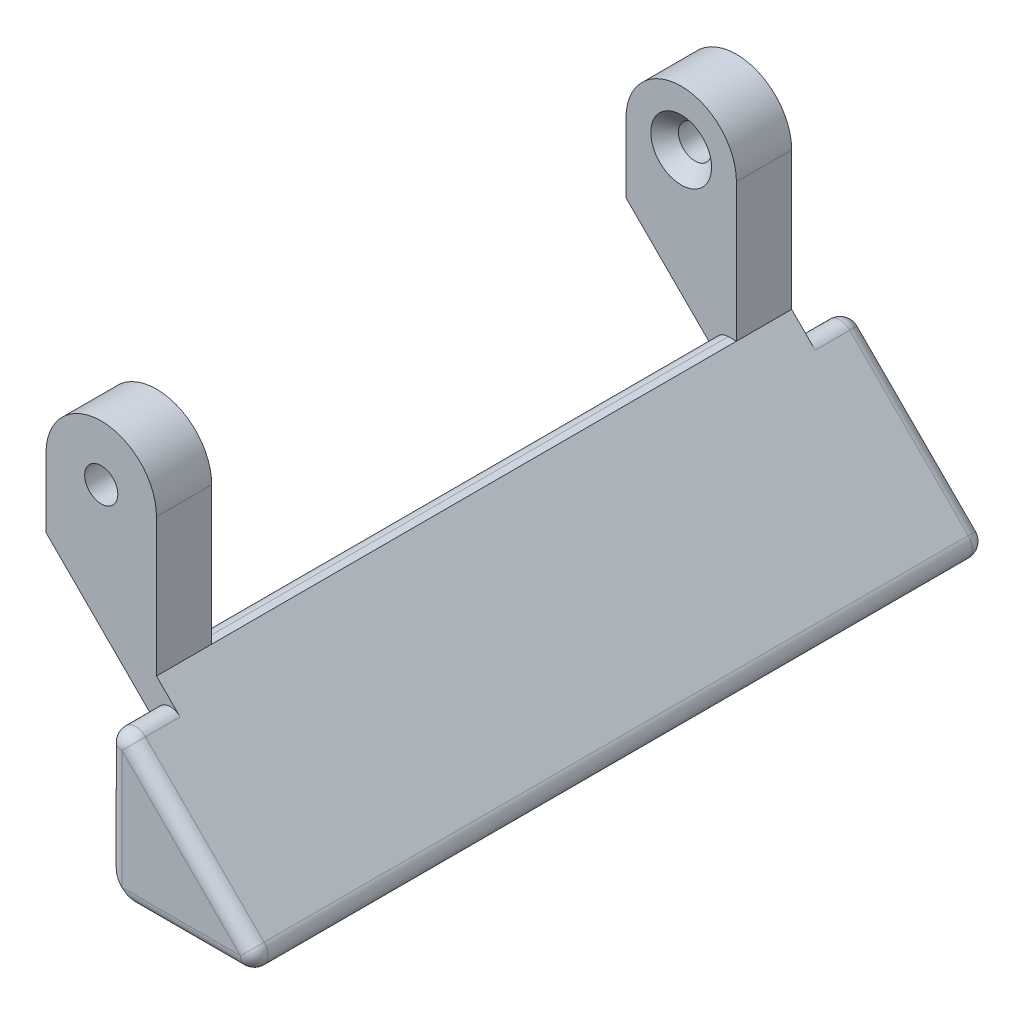
ISO-10303-21;
HEADER;
FILE_DESCRIPTION(('STEP AP214'),'2;1');
FILE_NAME('part.step','',(''),(''),'','','');
FILE_SCHEMA(('AUTOMOTIVE_DESIGN { 1 0 10303 214 1 1 1 1 }'));
ENDSEC;
DATA;
#1=APPLICATION_CONTEXT('core data for automotive mechanical design processes');
#2=APPLICATION_PROTOCOL_DEFINITION('international standard','automotive_design',2000,#1);
#3=PRODUCT_CONTEXT('',#1,'mechanical');
#4=PRODUCT('Part','Part','',(#3));
#5=PRODUCT_RELATED_PRODUCT_CATEGORY('part','',(#4));
#6=PRODUCT_DEFINITION_FORMATION('','',#4);
#7=PRODUCT_DEFINITION_CONTEXT('part definition',#1,'design');
#8=PRODUCT_DEFINITION('design','',#6,#7);
#9=PRODUCT_DEFINITION_SHAPE('','',#8);
#10=(LENGTH_UNIT() NAMED_UNIT(*) SI_UNIT(.MILLI.,.METRE.));
#11=(NAMED_UNIT(*) PLANE_ANGLE_UNIT() SI_UNIT($,.RADIAN.));
#12=(NAMED_UNIT(*) SI_UNIT($,.STERADIAN.) SOLID_ANGLE_UNIT());
#13=UNCERTAINTY_MEASURE_WITH_UNIT(LENGTH_MEASURE(1.E-05),#10,'distance_accuracy_value','');
#14=(GEOMETRIC_REPRESENTATION_CONTEXT(3) GLOBAL_UNCERTAINTY_ASSIGNED_CONTEXT((#13)) GLOBAL_UNIT_ASSIGNED_CONTEXT((#10,
#11,#12)) REPRESENTATION_CONTEXT('',''));
#15=CARTESIAN_POINT('',(0.,0.,0.));
#16=DIRECTION('',(0.,0.,1.));
#17=DIRECTION('',(1.,0.,0.));
#18=AXIS2_PLACEMENT_3D('',#15,#16,#17);
#19=CARTESIAN_POINT('',(0.,0.,53.));
#20=DIRECTION('',(1.,0.,0.));
#21=DIRECTION('',(0.,0.,-1.));
#22=AXIS2_PLACEMENT_3D('',#19,#20,#21);
#23=PLANE('',#22);
#24=DIRECTION('',(0.,1.,0.));
#25=VECTOR('',#24,1.);
#26=CARTESIAN_POINT('',(0.,0.,3.5));
#27=LINE('',#26,#25);
#28=CARTESIAN_POINT('',(0.,17.,3.5));
#29=VERTEX_POINT('',#28);
#30=CARTESIAN_POINT('',(0.,22.,3.5));
#31=VERTEX_POINT('',#30);
#32=EDGE_CURVE('E421',#29,#31,#27,.T.);
#33=ORIENTED_EDGE('',*,*,#32,.F.);
#34=DIRECTION('',(0.,0.,1.));
#35=VECTOR('',#34,1.);
#36=CARTESIAN_POINT('',(0.,17.,0.));
#37=LINE('',#36,#35);
#38=CARTESIAN_POINT('',(0.,17.,7.5));
#39=VERTEX_POINT('',#38);
#40=EDGE_CURVE('E217',#29,#39,#37,.T.);
#41=ORIENTED_EDGE('',*,*,#40,.T.);
#42=DIRECTION('',(0.,1.,0.));
#43=VECTOR('',#42,1.);
#44=CARTESIAN_POINT('',(0.,19.9999999999999,7.5));
#45=LINE('',#44,#43);
#46=CARTESIAN_POINT('',(0.,22.,7.5));
#47=VERTEX_POINT('',#46);
#48=EDGE_CURVE('E416',#39,#47,#45,.T.);
#49=ORIENTED_EDGE('',*,*,#48,.T.);
#50=DIRECTION('',(0.,0.,-1.));
#51=VECTOR('',#50,1.);
#52=CARTESIAN_POINT('',(0.,22.,53.));
#53=LINE('',#52,#51);
#54=EDGE_CURVE('E247',#47,#31,#53,.T.);
#55=ORIENTED_EDGE('',*,*,#54,.T.);
#56=EDGE_LOOP('',(#33,#41,#49,#55));
#57=FACE_BOUND('',#56,.T.);
#58=ADVANCED_FACE('F45',(#57),#23,.F.);
#59=CARTESIAN_POINT('',(4.,22.,53.));
#60=DIRECTION('',(0.,0.,-1.));
#61=DIRECTION('',(-1.,0.,0.));
#62=AXIS2_PLACEMENT_3D('',#59,#60,#61);
#63=CYLINDRICAL_SURFACE('',#62,4.);
#64=CARTESIAN_POINT('',(4.,22.,45.5));
#65=DIRECTION('',(0.,0.,-1.));
#66=DIRECTION('',(-1.,0.,0.));
#67=AXIS2_PLACEMENT_3D('',#64,#65,#66);
#68=CIRCLE('',#67,4.);
#69=CARTESIAN_POINT('',(8.,22.,45.5));
#70=VERTEX_POINT('',#69);
#71=CARTESIAN_POINT('',(0.,22.,45.5));
#72=VERTEX_POINT('',#71);
#73=EDGE_CURVE('E227',#70,#72,#68,.F.);
#74=ORIENTED_EDGE('',*,*,#73,.T.);
#75=CARTESIAN_POINT('',(0.,22.,49.5));
#76=VERTEX_POINT('',#75);
#77=EDGE_CURVE('E244',#76,#72,#53,.T.);
#78=ORIENTED_EDGE('',*,*,#77,.F.);
#79=CARTESIAN_POINT('',(4.,22.,49.5));
#80=DIRECTION('',(0.,0.,-1.));
#81=DIRECTION('',(-1.,0.,0.));
#82=AXIS2_PLACEMENT_3D('',#79,#80,#81);
#83=CIRCLE('',#82,4.);
#84=CARTESIAN_POINT('',(8.,22.,49.5));
#85=VERTEX_POINT('',#84);
#86=EDGE_CURVE('E221',#76,#85,#83,.T.);
#87=ORIENTED_EDGE('',*,*,#86,.T.);
#88=DIRECTION('',(0.,0.,-1.));
#89=VECTOR('',#88,1.);
#90=CARTESIAN_POINT('',(8.,22.,53.));
#91=LINE('',#90,#89);
#92=EDGE_CURVE('E237',#85,#70,#91,.T.);
#93=ORIENTED_EDGE('',*,*,#92,.T.);
#94=EDGE_LOOP('',(#74,#78,#87,#93));
#95=FACE_BOUND('',#94,.T.);
#96=ADVANCED_FACE('F406',(#95),#63,.T.);
#97=CARTESIAN_POINT('',(8.,11.9999999999999,53.));
#98=DIRECTION('',(-1.,0.,0.));
#99=DIRECTION('',(0.,0.,1.));
#100=AXIS2_PLACEMENT_3D('',#97,#98,#99);
#101=PLANE('',#100);
#102=DIRECTION('',(0.,1.,0.));
#103=VECTOR('',#102,1.);
#104=CARTESIAN_POINT('',(8.,22.,45.5));
#105=LINE('',#104,#103);
#106=CARTESIAN_POINT('',(8.,11.9999999999999,45.5));
#107=VERTEX_POINT('',#106);
#108=EDGE_CURVE('E223',#107,#70,#105,.T.);
#109=ORIENTED_EDGE('',*,*,#108,.T.);
#110=ORIENTED_EDGE('',*,*,#92,.F.);
#111=DIRECTION('',(0.,1.,0.));
#112=VECTOR('',#111,1.);
#113=CARTESIAN_POINT('',(8.,0.,49.5));
#114=LINE('',#113,#112);
#115=CARTESIAN_POINT('',(8.,11.9999999999999,49.5));
#116=VERTEX_POINT('',#115);
#117=EDGE_CURVE('E222',#116,#85,#114,.T.);
#118=ORIENTED_EDGE('',*,*,#117,.F.);
#119=DIRECTION('',(0.,0.,-1.));
#120=VECTOR('',#119,1.);
#121=CARTESIAN_POINT('',(8.,11.9999999999999,53.));
#122=LINE('',#121,#120);
#123=EDGE_CURVE('E243',#116,#107,#122,.T.);
#124=ORIENTED_EDGE('',*,*,#123,.T.);
#125=EDGE_LOOP('',(#109,#110,#118,#124));
#126=FACE_BOUND('',#125,.T.);
#127=ADVANCED_FACE('F402',(#126),#101,.F.);
#128=CARTESIAN_POINT('',(4.,22.,53.));
#129=DIRECTION('',(0.,0.,1.));
#130=DIRECTION('',(1.,0.,0.));
#131=AXIS2_PLACEMENT_3D('',#128,#129,#130);
#132=PLANE('',#131);
#133=DIRECTION('',(-0.707106781186551,0.707106781186544,0.));
#134=VECTOR('',#133,1.);
#135=CARTESIAN_POINT('',(7.29289321881346,11.2928932188133,53.));
#136=LINE('',#135,#134);
#137=CARTESIAN_POINT('',(17.5857864376269,1.,53.));
#138=VERTEX_POINT('',#137);
#139=CARTESIAN_POINT('',(9.,9.58578643762679,53.));
#140=VERTEX_POINT('',#139);
#141=EDGE_CURVE('E301',#138,#140,#136,.T.);
#142=ORIENTED_EDGE('',*,*,#141,.T.);
#143=DIRECTION('',(0.,1.,0.));
#144=VECTOR('',#143,1.);
#145=CARTESIAN_POINT('',(9.,2.,53.));
#146=LINE('',#145,#144);
#147=CARTESIAN_POINT('',(9.00000000000001,0.999999999999999,53.));
#148=VERTEX_POINT('',#147);
#149=EDGE_CURVE('E339',#140,#148,#146,.F.);
#150=ORIENTED_EDGE('',*,*,#149,.T.);
#151=DIRECTION('',(1.,0.,0.));
#152=VECTOR('',#151,1.);
#153=CARTESIAN_POINT('',(20.,1.,53.));
#154=LINE('',#153,#152);
#155=EDGE_CURVE('E299',#148,#138,#154,.T.);
#156=ORIENTED_EDGE('',*,*,#155,.T.);
#157=EDGE_LOOP('',(#142,#150,#156));
#158=FACE_BOUND('',#157,.T.);
#159=ADVANCED_FACE('F384',(#158),#132,.T.);
#160=CARTESIAN_POINT('',(4.,22.,0.));
#161=DIRECTION('',(0.,0.,1.));
#162=DIRECTION('',(1.,0.,0.));
#163=AXIS2_PLACEMENT_3D('',#160,#161,#162);
#164=PLANE('',#163);
#165=DIRECTION('',(1.,0.,0.));
#166=VECTOR('',#165,1.);
#167=CARTESIAN_POINT('',(4.,1.,0.));
#168=LINE('',#167,#166);
#169=CARTESIAN_POINT('',(17.5857864376269,1.,0.));
#170=VERTEX_POINT('',#169);
#171=CARTESIAN_POINT('',(9.00000000000001,1.,0.));
#172=VERTEX_POINT('',#171);
#173=EDGE_CURVE('E289',#170,#172,#168,.F.);
#174=ORIENTED_EDGE('',*,*,#173,.T.);
#175=DIRECTION('',(0.,-1.,0.));
#176=VECTOR('',#175,1.);
#177=CARTESIAN_POINT('',(9.,22.,0.));
#178=LINE('',#177,#176);
#179=CARTESIAN_POINT('',(9.,9.58578643762679,0.));
#180=VERTEX_POINT('',#179);
#181=EDGE_CURVE('E335',#172,#180,#178,.F.);
#182=ORIENTED_EDGE('',*,*,#181,.T.);
#183=DIRECTION('',(-0.707106781186551,0.707106781186544,0.));
#184=VECTOR('',#183,1.);
#185=CARTESIAN_POINT('',(0.292893218813369,18.2928932188133,0.));
#186=LINE('',#185,#184);
#187=EDGE_CURVE('E292',#180,#170,#186,.F.);
#188=ORIENTED_EDGE('',*,*,#187,.T.);
#189=EDGE_LOOP('',(#174,#182,#188));
#190=FACE_BOUND('',#189,.T.);
#191=ADVANCED_FACE('F443',(#190),#164,.F.);
#192=ORIENTED_EDGE('',*,*,#54,.F.);
#193=CARTESIAN_POINT('',(4.,22.,7.5));
#194=DIRECTION('',(0.,0.,-1.));
#195=DIRECTION('',(0.,1.,0.));
#196=AXIS2_PLACEMENT_3D('',#193,#194,#195);
#197=CIRCLE('',#196,4.);
#198=CARTESIAN_POINT('',(8.,22.,7.5));
#199=VERTEX_POINT('',#198);
#200=EDGE_CURVE('E409',#47,#199,#197,.T.);
#201=ORIENTED_EDGE('',*,*,#200,.T.);
#202=CARTESIAN_POINT('',(8.,22.,3.5));
#203=VERTEX_POINT('',#202);
#204=EDGE_CURVE('E236',#199,#203,#91,.T.);
#205=ORIENTED_EDGE('',*,*,#204,.T.);
#206=CARTESIAN_POINT('',(4.,22.,3.5));
#207=DIRECTION('',(0.,0.,1.));
#208=DIRECTION('',(1.,0.,0.));
#209=AXIS2_PLACEMENT_3D('',#206,#207,#208);
#210=CIRCLE('',#209,4.);
#211=EDGE_CURVE('E232',#203,#31,#210,.T.);
#212=ORIENTED_EDGE('',*,*,#211,.T.);
#213=EDGE_LOOP('',(#192,#201,#205,#212));
#214=FACE_BOUND('',#213,.T.);
#215=ADVANCED_FACE('F470',(#214),#63,.T.);
#216=DIRECTION('',(0.,-1.,0.));
#217=VECTOR('',#216,1.);
#218=CARTESIAN_POINT('',(0.,19.9999999999999,45.5));
#219=LINE('',#218,#217);
#220=CARTESIAN_POINT('',(0.,17.,45.5));
#221=VERTEX_POINT('',#220);
#222=EDGE_CURVE('E216',#72,#221,#219,.T.);
#223=ORIENTED_EDGE('',*,*,#222,.T.);
#224=CARTESIAN_POINT('',(0.,17.,49.5));
#225=VERTEX_POINT('',#224);
#226=EDGE_CURVE('E199',#221,#225,#37,.T.);
#227=ORIENTED_EDGE('',*,*,#226,.T.);
#228=DIRECTION('',(0.,-1.,0.));
#229=VECTOR('',#228,1.);
#230=CARTESIAN_POINT('',(0.,0.,49.5));
#231=LINE('',#230,#229);
#232=EDGE_CURVE('E214',#76,#225,#231,.T.);
#233=ORIENTED_EDGE('',*,*,#232,.F.);
#234=ORIENTED_EDGE('',*,*,#77,.T.);
#235=EDGE_LOOP('',(#223,#227,#233,#234));
#236=FACE_BOUND('',#235,.T.);
#237=ADVANCED_FACE('F212',(#236),#23,.F.);
#238=CARTESIAN_POINT('',(0.,0.,53.));
#239=DIRECTION('',(0.,1.,0.));
#240=DIRECTION('',(0.,0.,1.));
#241=AXIS2_PLACEMENT_3D('',#238,#239,#240);
#242=PLANE('',#241);
#243=DIRECTION('',(0.,0.,-1.));
#244=VECTOR('',#243,1.);
#245=CARTESIAN_POINT('',(10.,0.,53.));
#246=LINE('',#245,#244);
#247=CARTESIAN_POINT('',(10.,0.,52.));
#248=VERTEX_POINT('',#247);
#249=CARTESIAN_POINT('',(10.,0.,1.));
#250=VERTEX_POINT('',#249);
#251=EDGE_CURVE('E250',#248,#250,#246,.T.);
#252=ORIENTED_EDGE('',*,*,#251,.T.);
#253=DIRECTION('',(1.,0.,0.));
#254=VECTOR('',#253,1.);
#255=CARTESIAN_POINT('',(0.,0.,1.));
#256=LINE('',#255,#254);
#257=CARTESIAN_POINT('',(17.5857864376269,0.,1.));
#258=VERTEX_POINT('',#257);
#259=EDGE_CURVE('E287',#250,#258,#256,.T.);
#260=ORIENTED_EDGE('',*,*,#259,.T.);
#261=DIRECTION('',(0.,0.,-1.));
#262=VECTOR('',#261,1.);
#263=CARTESIAN_POINT('',(17.5857864376269,0.,53.));
#264=LINE('',#263,#262);
#265=CARTESIAN_POINT('',(17.5857864376269,0.,52.));
#266=VERTEX_POINT('',#265);
#267=EDGE_CURVE('E285',#258,#266,#264,.F.);
#268=ORIENTED_EDGE('',*,*,#267,.T.);
#269=DIRECTION('',(1.,0.,0.));
#270=VECTOR('',#269,1.);
#271=CARTESIAN_POINT('',(10.,0.,52.));
#272=LINE('',#271,#270);
#273=EDGE_CURVE('E283',#266,#248,#272,.F.);
#274=ORIENTED_EDGE('',*,*,#273,.T.);
#275=EDGE_LOOP('',(#252,#260,#268,#274));
#276=FACE_BOUND('',#275,.T.);
#277=ADVANCED_FACE('F452',(#276),#242,.F.);
#278=CARTESIAN_POINT('',(20.,0.,53.));
#279=DIRECTION('',(-0.707106781186544,-0.707106781186551,0.));
#280=DIRECTION('',(0.707106781186551,-0.707106781186544,0.));
#281=AXIS2_PLACEMENT_3D('',#278,#279,#280);
#282=PLANE('',#281);
#283=DIRECTION('',(-0.707106781186551,0.707106781186544,0.));
#284=VECTOR('',#283,1.);
#285=CARTESIAN_POINT('',(20.,0.,1.));
#286=LINE('',#285,#284);
#287=CARTESIAN_POINT('',(18.2928932188134,1.70710678118655,1.));
#288=VERTEX_POINT('',#287);
#289=CARTESIAN_POINT('',(9.70710678118654,10.2928932188133,1.));
#290=VERTEX_POINT('',#289);
#291=EDGE_CURVE('E280',#288,#290,#286,.T.);
#292=ORIENTED_EDGE('',*,*,#291,.T.);
#293=DIRECTION('',(0.,0.,-1.));
#294=VECTOR('',#293,1.);
#295=CARTESIAN_POINT('',(9.70710678118655,10.2928932188133,53.));
#296=LINE('',#295,#294);
#297=CARTESIAN_POINT('',(9.70710678118655,10.2928932188133,3.5));
#298=VERTEX_POINT('',#297);
#299=EDGE_CURVE('E347',#290,#298,#296,.F.);
#300=ORIENTED_EDGE('',*,*,#299,.T.);
#301=DIRECTION('',(-0.707106781186551,0.707106781186544,0.));
#302=VECTOR('',#301,1.);
#303=CARTESIAN_POINT('',(20.,0.,3.5));
#304=LINE('',#303,#302);
#305=CARTESIAN_POINT('',(8.,11.9999999999999,3.5));
#306=VERTEX_POINT('',#305);
#307=EDGE_CURVE('E69',#298,#306,#304,.T.);
#308=ORIENTED_EDGE('',*,*,#307,.T.);
#309=CARTESIAN_POINT('',(8.,12.,7.49999999999999));
#310=VERTEX_POINT('',#309);
#311=EDGE_CURVE('E240',#310,#306,#122,.T.);
#312=ORIENTED_EDGE('',*,*,#311,.F.);
#313=DIRECTION('',(0.,0.,1.));
#314=VECTOR('',#313,1.);
#315=CARTESIAN_POINT('',(7.99999999999987,12.,53.));
#316=LINE('',#315,#314);
#317=EDGE_CURVE('E398',#310,#107,#316,.T.);
#318=ORIENTED_EDGE('',*,*,#317,.T.);
#319=ORIENTED_EDGE('',*,*,#123,.F.);
#320=DIRECTION('',(0.707106781186551,-0.707106781186544,0.));
#321=VECTOR('',#320,1.);
#322=CARTESIAN_POINT('',(20.,0.,49.5));
#323=LINE('',#322,#321);
#324=CARTESIAN_POINT('',(9.70710678118655,10.2928932188133,49.5));
#325=VERTEX_POINT('',#324);
#326=EDGE_CURVE('E61',#116,#325,#323,.T.);
#327=ORIENTED_EDGE('',*,*,#326,.T.);
#328=DIRECTION('',(0.,0.,-1.));
#329=VECTOR('',#328,1.);
#330=CARTESIAN_POINT('',(9.70710678118655,10.2928932188133,53.));
#331=LINE('',#330,#329);
#332=CARTESIAN_POINT('',(9.70710678118654,10.2928932188133,52.));
#333=VERTEX_POINT('',#332);
#334=EDGE_CURVE('E343',#325,#333,#331,.F.);
#335=ORIENTED_EDGE('',*,*,#334,.T.);
#336=DIRECTION('',(-0.707106781186551,0.707106781186544,0.));
#337=VECTOR('',#336,1.);
#338=CARTESIAN_POINT('',(20.,0.,52.));
#339=LINE('',#338,#337);
#340=CARTESIAN_POINT('',(18.2928932188134,1.70710678118655,52.));
#341=VERTEX_POINT('',#340);
#342=EDGE_CURVE('E275',#333,#341,#339,.F.);
#343=ORIENTED_EDGE('',*,*,#342,.T.);
#344=DIRECTION('',(0.,0.,-1.));
#345=VECTOR('',#344,1.);
#346=CARTESIAN_POINT('',(18.2928932188134,1.70710678118655,53.));
#347=LINE('',#346,#345);
#348=EDGE_CURVE('E277',#341,#288,#347,.T.);
#349=ORIENTED_EDGE('',*,*,#348,.T.);
#350=EDGE_LOOP('',(#292,#300,#308,#312,#318,#319,#327,#335,#343,#349));
#351=FACE_BOUND('',#350,.T.);
#352=ADVANCED_FACE('F391',(#351),#282,.F.);
#353=ORIENTED_EDGE('',*,*,#204,.F.);
#354=DIRECTION('',(0.,-1.,0.));
#355=VECTOR('',#354,1.);
#356=CARTESIAN_POINT('',(8.,22.,7.5));
#357=LINE('',#356,#355);
#358=EDGE_CURVE('E413',#199,#310,#357,.T.);
#359=ORIENTED_EDGE('',*,*,#358,.T.);
#360=ORIENTED_EDGE('',*,*,#311,.T.);
#361=DIRECTION('',(0.,-1.,0.));
#362=VECTOR('',#361,1.);
#363=CARTESIAN_POINT('',(8.,0.,3.5));
#364=LINE('',#363,#362);
#365=EDGE_CURVE('E233',#203,#306,#364,.T.);
#366=ORIENTED_EDGE('',*,*,#365,.F.);
#367=EDGE_LOOP('',(#353,#359,#360,#366));
#368=FACE_BOUND('',#367,.T.);
#369=ADVANCED_FACE('F466',(#368),#101,.F.);
#370=CARTESIAN_POINT('',(8.,0.,0.));
#371=DIRECTION('',(1.,0.,0.));
#372=DIRECTION('',(0.,0.,-1.));
#373=AXIS2_PLACEMENT_3D('',#370,#371,#372);
#374=PLANE('',#373);
#375=DIRECTION('',(0.,0.,-1.));
#376=VECTOR('',#375,1.);
#377=CARTESIAN_POINT('',(8.,9.58578643762679,0.));
#378=LINE('',#377,#376);
#379=CARTESIAN_POINT('',(8.,9.58578643762679,3.5));
#380=VERTEX_POINT('',#379);
#381=CARTESIAN_POINT('',(8.,9.58578643762679,1.));
#382=VERTEX_POINT('',#381);
#383=EDGE_CURVE('E326',#380,#382,#378,.T.);
#384=ORIENTED_EDGE('',*,*,#383,.T.);
#385=DIRECTION('',(0.,-1.,0.));
#386=VECTOR('',#385,1.);
#387=CARTESIAN_POINT('',(8.,0.,1.));
#388=LINE('',#387,#386);
#389=CARTESIAN_POINT('',(8.,2.,1.));
#390=VERTEX_POINT('',#389);
#391=EDGE_CURVE('E328',#382,#390,#388,.T.);
#392=ORIENTED_EDGE('',*,*,#391,.T.);
#393=DIRECTION('',(0.,0.,1.));
#394=VECTOR('',#393,1.);
#395=CARTESIAN_POINT('',(8.,2.,0.));
#396=LINE('',#395,#394);
#397=CARTESIAN_POINT('',(8.,2.,52.));
#398=VERTEX_POINT('',#397);
#399=EDGE_CURVE('E246',#390,#398,#396,.T.);
#400=ORIENTED_EDGE('',*,*,#399,.T.);
#401=DIRECTION('',(0.,1.,0.));
#402=VECTOR('',#401,1.);
#403=CARTESIAN_POINT('',(8.,10.5857864376268,52.));
#404=LINE('',#403,#402);
#405=CARTESIAN_POINT('',(8.,9.58578643762679,52.));
#406=VERTEX_POINT('',#405);
#407=EDGE_CURVE('E323',#398,#406,#404,.T.);
#408=ORIENTED_EDGE('',*,*,#407,.T.);
#409=DIRECTION('',(0.,0.,-1.));
#410=VECTOR('',#409,1.);
#411=CARTESIAN_POINT('',(8.,9.58578643762679,0.));
#412=LINE('',#411,#410);
#413=CARTESIAN_POINT('',(8.,9.58578643762679,49.5));
#414=VERTEX_POINT('',#413);
#415=EDGE_CURVE('E304',#406,#414,#412,.T.);
#416=ORIENTED_EDGE('',*,*,#415,.T.);
#417=CARTESIAN_POINT('',(8.,9.,49.5));
#418=VERTEX_POINT('',#417);
#419=EDGE_CURVE('E225',#418,#414,#114,.T.);
#420=ORIENTED_EDGE('',*,*,#419,.F.);
#421=DIRECTION('',(0.,0.,-1.));
#422=VECTOR('',#421,1.);
#423=CARTESIAN_POINT('',(8.,9.,3.5));
#424=LINE('',#423,#422);
#425=CARTESIAN_POINT('',(8.,9.,3.5));
#426=VERTEX_POINT('',#425);
#427=EDGE_CURVE('E203',#418,#426,#424,.T.);
#428=ORIENTED_EDGE('',*,*,#427,.T.);
#429=EDGE_CURVE('E420',#380,#426,#364,.T.);
#430=ORIENTED_EDGE('',*,*,#429,.F.);
#431=EDGE_LOOP('',(#384,#392,#400,#408,#416,#420,#428,#430));
#432=FACE_BOUND('',#431,.T.);
#433=ADVANCED_FACE('F369',(#432),#374,.F.);
#434=CARTESIAN_POINT('',(34.2345192446898,0.,49.5));
#435=DIRECTION('',(0.,0.,-1.));
#436=DIRECTION('',(-1.,0.,0.));
#437=AXIS2_PLACEMENT_3D('',#434,#435,#436);
#438=PLANE('',#437);
#439=CARTESIAN_POINT('',(4.,22.,49.5));
#440=DIRECTION('',(0.,0.,-1.));
#441=DIRECTION('',(-1.,0.,0.));
#442=AXIS2_PLACEMENT_3D('',#439,#440,#441);
#443=CIRCLE('',#442,1.2);
#444=CARTESIAN_POINT('',(2.8,22.,49.5));
#445=VERTEX_POINT('',#444);
#446=EDGE_CURVE('E260',#445,#445,#443,.T.);
#447=ORIENTED_EDGE('',*,*,#446,.T.);
#448=EDGE_LOOP('',(#447));
#449=FACE_BOUND('',#448,.T.);
#450=ORIENTED_EDGE('',*,*,#232,.T.);
#451=DIRECTION('',(-0.707106781186544,0.707106781186551,0.));
#452=VECTOR('',#451,1.);
#453=CARTESIAN_POINT('',(25.6172596223448,-8.61725962234495,49.5));
#454=LINE('',#453,#452);
#455=EDGE_CURVE('E196',#225,#418,#454,.F.);
#456=ORIENTED_EDGE('',*,*,#455,.T.);
#457=ORIENTED_EDGE('',*,*,#419,.T.);
#458=CARTESIAN_POINT('',(9.,9.58578643762679,49.5));
#459=DIRECTION('',(0.,0.,-1.));
#460=DIRECTION('',(-1.,0.,0.));
#461=AXIS2_PLACEMENT_3D('',#458,#459,#460);
#462=CIRCLE('',#461,1.);
#463=EDGE_CURVE('E13',#414,#325,#462,.T.);
#464=ORIENTED_EDGE('',*,*,#463,.T.);
#465=ORIENTED_EDGE('',*,*,#326,.F.);
#466=ORIENTED_EDGE('',*,*,#117,.T.);
#467=ORIENTED_EDGE('',*,*,#86,.F.);
#468=EDGE_LOOP('',(#450,#456,#457,#464,#465,#466,#467));
#469=FACE_BOUND('',#468,.T.);
#470=ADVANCED_FACE('F220',(#449,#469),#438,.F.);
#471=CARTESIAN_POINT('',(34.2345192446898,0.,3.5));
#472=DIRECTION('',(0.,0.,1.));
#473=DIRECTION('',(1.,0.,0.));
#474=AXIS2_PLACEMENT_3D('',#471,#472,#473);
#475=PLANE('',#474);
#476=CARTESIAN_POINT('',(4.,22.,3.5));
#477=DIRECTION('',(0.,0.,1.));
#478=DIRECTION('',(1.,0.,0.));
#479=AXIS2_PLACEMENT_3D('',#476,#477,#478);
#480=CIRCLE('',#479,1.2);
#481=CARTESIAN_POINT('',(5.2,22.,3.5));
#482=VERTEX_POINT('',#481);
#483=EDGE_CURVE('E255',#482,#482,#480,.T.);
#484=ORIENTED_EDGE('',*,*,#483,.T.);
#485=EDGE_LOOP('',(#484));
#486=FACE_BOUND('',#485,.T.);
#487=DIRECTION('',(0.707106781186544,-0.707106781186551,0.));
#488=VECTOR('',#487,1.);
#489=CARTESIAN_POINT('',(25.6172596223448,-8.61725962234495,3.5));
#490=LINE('',#489,#488);
#491=EDGE_CURVE('E207',#426,#29,#490,.F.);
#492=ORIENTED_EDGE('',*,*,#491,.T.);
#493=ORIENTED_EDGE('',*,*,#32,.T.);
#494=ORIENTED_EDGE('',*,*,#211,.F.);
#495=ORIENTED_EDGE('',*,*,#365,.T.);
#496=ORIENTED_EDGE('',*,*,#307,.F.);
#497=CARTESIAN_POINT('',(9.,9.58578643762679,3.5));
#498=DIRECTION('',(0.,0.,1.));
#499=DIRECTION('',(1.,0.,0.));
#500=AXIS2_PLACEMENT_3D('',#497,#498,#499);
#501=CIRCLE('',#500,1.);
#502=EDGE_CURVE('E54',#298,#380,#501,.T.);
#503=ORIENTED_EDGE('',*,*,#502,.T.);
#504=ORIENTED_EDGE('',*,*,#429,.T.);
#505=EDGE_LOOP('',(#492,#493,#494,#495,#496,#503,#504));
#506=FACE_BOUND('',#505,.T.);
#507=ADVANCED_FACE('F467',(#486,#506),#475,.F.);
#508=CARTESIAN_POINT('',(8.,2.,0.));
#509=DIRECTION('',(0.707106781186546,0.707106781186549,0.));
#510=DIRECTION('',(0.,0.,1.));
#511=AXIS2_PLACEMENT_3D('',#508,#509,#510);
#512=PLANE('',#511);
#513=ORIENTED_EDGE('',*,*,#399,.F.);
#514=CARTESIAN_POINT('',(9.,1.,1.));
#515=DIRECTION('',(0.707106781186546,0.707106781186549,0.));
#516=DIRECTION('',(0.707106781186549,-0.707106781186546,0.));
#517=AXIS2_PLACEMENT_3D('',#514,#515,#516);
#518=ELLIPSE('',#517,1.41421356237309,1.);
#519=EDGE_CURVE('E333',#390,#172,#518,.F.);
#520=ORIENTED_EDGE('',*,*,#519,.T.);
#521=CARTESIAN_POINT('',(9.00000000000001,1.,1.));
#522=DIRECTION('',(0.707106781186546,0.707106781186549,0.));
#523=DIRECTION('',(0.707106781186549,-0.707106781186546,0.));
#524=AXIS2_PLACEMENT_3D('',#521,#522,#523);
#525=ELLIPSE('',#524,1.4142135623731,1.);
#526=EDGE_CURVE('E297',#172,#250,#525,.F.);
#527=ORIENTED_EDGE('',*,*,#526,.T.);
#528=ORIENTED_EDGE('',*,*,#251,.F.);
#529=CARTESIAN_POINT('',(9.00000000000001,1.,52.));
#530=DIRECTION('',(0.707106781186546,0.707106781186549,0.));
#531=DIRECTION('',(-0.707106781186549,0.707106781186546,0.));
#532=AXIS2_PLACEMENT_3D('',#529,#530,#531);
#533=ELLIPSE('',#532,1.4142135623731,1.);
#534=EDGE_CURVE('E294',#248,#148,#533,.F.);
#535=ORIENTED_EDGE('',*,*,#534,.T.);
#536=CARTESIAN_POINT('',(9.,1.,52.));
#537=DIRECTION('',(0.707106781186546,0.707106781186549,0.));
#538=DIRECTION('',(0.707106781186549,-0.707106781186546,0.));
#539=AXIS2_PLACEMENT_3D('',#536,#537,#538);
#540=ELLIPSE('',#539,1.41421356237309,1.);
#541=EDGE_CURVE('E331',#148,#398,#540,.F.);
#542=ORIENTED_EDGE('',*,*,#541,.T.);
#543=EDGE_LOOP('',(#513,#520,#527,#528,#535,#542));
#544=FACE_BOUND('',#543,.T.);
#545=ADVANCED_FACE('F374',(#544),#512,.F.);
#546=CARTESIAN_POINT('',(8.,9.,0.));
#547=DIRECTION('',(-0.707106781186551,-0.707106781186544,0.));
#548=DIRECTION('',(0.,0.,1.));
#549=AXIS2_PLACEMENT_3D('',#546,#547,#548);
#550=PLANE('',#549);
#551=DIRECTION('',(0.707106781186547,-0.707106781186548,0.));
#552=VECTOR('',#551,1.);
#553=CARTESIAN_POINT('',(25.6172596223449,-8.61725962234491,45.5));
#554=LINE('',#553,#552);
#555=CARTESIAN_POINT('',(6.70710678118656,10.2928932188135,45.5));
#556=VERTEX_POINT('',#555);
#557=EDGE_CURVE('E494',#221,#556,#554,.T.);
#558=ORIENTED_EDGE('',*,*,#557,.T.);
#559=DIRECTION('',(0.,0.,1.));
#560=VECTOR('',#559,1.);
#561=CARTESIAN_POINT('',(6.70710678118656,10.2928932188135,0.));
#562=LINE('',#561,#560);
#563=CARTESIAN_POINT('',(6.70710678118656,10.2928932188135,7.5));
#564=VERTEX_POINT('',#563);
#565=EDGE_CURVE('E267',#556,#564,#562,.F.);
#566=ORIENTED_EDGE('',*,*,#565,.T.);
#567=DIRECTION('',(0.707106781186547,-0.707106781186548,0.));
#568=VECTOR('',#567,1.);
#569=CARTESIAN_POINT('',(-0.499999999999987,17.5,7.5));
#570=LINE('',#569,#568);
#571=EDGE_CURVE('E492',#39,#564,#570,.T.);
#572=ORIENTED_EDGE('',*,*,#571,.F.);
#573=ORIENTED_EDGE('',*,*,#40,.F.);
#574=ORIENTED_EDGE('',*,*,#491,.F.);
#575=ORIENTED_EDGE('',*,*,#427,.F.);
#576=ORIENTED_EDGE('',*,*,#455,.F.);
#577=ORIENTED_EDGE('',*,*,#226,.F.);
#578=EDGE_LOOP('',(#558,#566,#572,#573,#574,#575,#576,#577));
#579=FACE_BOUND('',#578,.T.);
#580=ADVANCED_FACE('F198',(#579),#550,.T.);
#581=CARTESIAN_POINT('',(4.,22.,7.5));
#582=DIRECTION('',(0.,0.,-1.));
#583=DIRECTION('',(0.,1.,0.));
#584=AXIS2_PLACEMENT_3D('',#581,#582,#583);
#585=PLANE('',#584);
#586=CARTESIAN_POINT('',(4.,22.,7.5));
#587=DIRECTION('',(0.,0.,1.));
#588=DIRECTION('',(0.,-1.,0.));
#589=AXIS2_PLACEMENT_3D('',#586,#587,#588);
#590=CIRCLE('',#589,2.2);
#591=CARTESIAN_POINT('',(4.,19.8,7.5));
#592=VERTEX_POINT('',#591);
#593=EDGE_CURVE('E263',#592,#592,#590,.T.);
#594=ORIENTED_EDGE('',*,*,#593,.F.);
#595=EDGE_LOOP('',(#594));
#596=FACE_BOUND('',#595,.T.);
#597=ORIENTED_EDGE('',*,*,#48,.F.);
#598=ORIENTED_EDGE('',*,*,#571,.T.);
#599=CARTESIAN_POINT('',(7.41421356237311,11.,7.5));
#600=DIRECTION('',(0.,0.,-1.));
#601=DIRECTION('',(0.,1.,0.));
#602=AXIS2_PLACEMENT_3D('',#599,#600,#601);
#603=CIRCLE('',#602,1.);
#604=CARTESIAN_POINT('',(7.41421356237311,12.,7.49999999999999));
#605=VERTEX_POINT('',#604);
#606=EDGE_CURVE('E273',#564,#605,#603,.T.);
#607=ORIENTED_EDGE('',*,*,#606,.T.);
#608=DIRECTION('',(1.,0.,0.));
#609=VECTOR('',#608,1.);
#610=CARTESIAN_POINT('',(0.,12.,7.49999999999999));
#611=LINE('',#610,#609);
#612=EDGE_CURVE('E476',#605,#310,#611,.T.);
#613=ORIENTED_EDGE('',*,*,#612,.T.);
#614=ORIENTED_EDGE('',*,*,#358,.F.);
#615=ORIENTED_EDGE('',*,*,#200,.F.);
#616=EDGE_LOOP('',(#597,#598,#607,#613,#614,#615));
#617=FACE_BOUND('',#616,.T.);
#618=ADVANCED_FACE('F474',(#596,#617),#585,.F.);
#619=CARTESIAN_POINT('',(34.2345192446898,0.,45.5));
#620=DIRECTION('',(0.,0.,-1.));
#621=DIRECTION('',(-1.,0.,0.));
#622=AXIS2_PLACEMENT_3D('',#619,#620,#621);
#623=PLANE('',#622);
#624=ORIENTED_EDGE('',*,*,#557,.F.);
#625=ORIENTED_EDGE('',*,*,#222,.F.);
#626=ORIENTED_EDGE('',*,*,#73,.F.);
#627=ORIENTED_EDGE('',*,*,#108,.F.);
#628=DIRECTION('',(1.,0.,0.));
#629=VECTOR('',#628,1.);
#630=CARTESIAN_POINT('',(0.,12.,45.5));
#631=LINE('',#630,#629);
#632=CARTESIAN_POINT('',(7.41421356237311,12.,45.5));
#633=VERTEX_POINT('',#632);
#634=EDGE_CURVE('E258',#633,#107,#631,.T.);
#635=ORIENTED_EDGE('',*,*,#634,.F.);
#636=CARTESIAN_POINT('',(7.41421356237311,11.,45.5));
#637=DIRECTION('',(0.,0.,-1.));
#638=DIRECTION('',(-1.,0.,0.));
#639=AXIS2_PLACEMENT_3D('',#636,#637,#638);
#640=CIRCLE('',#639,1.);
#641=EDGE_CURVE('E270',#633,#556,#640,.F.);
#642=ORIENTED_EDGE('',*,*,#641,.T.);
#643=EDGE_LOOP('',(#624,#625,#626,#627,#635,#642));
#644=FACE_BOUND('',#643,.T.);
#645=CARTESIAN_POINT('',(4.,22.,45.5));
#646=DIRECTION('',(0.,0.,-1.));
#647=DIRECTION('',(-1.,0.,0.));
#648=AXIS2_PLACEMENT_3D('',#645,#646,#647);
#649=CIRCLE('',#648,2.2);
#650=CARTESIAN_POINT('',(1.8,22.,45.5));
#651=VERTEX_POINT('',#650);
#652=EDGE_CURVE('E489',#651,#651,#649,.T.);
#653=ORIENTED_EDGE('',*,*,#652,.F.);
#654=EDGE_LOOP('',(#653));
#655=FACE_BOUND('',#654,.T.);
#656=ADVANCED_FACE('F503',(#644,#655),#623,.T.);
#657=CARTESIAN_POINT('',(0.,12.,45.5));
#658=DIRECTION('',(0.,-1.,0.));
#659=DIRECTION('',(0.,0.,-1.));
#660=AXIS2_PLACEMENT_3D('',#657,#658,#659);
#661=PLANE('',#660);
#662=ORIENTED_EDGE('',*,*,#612,.F.);
#663=DIRECTION('',(0.,0.,-1.));
#664=VECTOR('',#663,1.);
#665=CARTESIAN_POINT('',(7.41421356237311,12.,45.5));
#666=LINE('',#665,#664);
#667=EDGE_CURVE('E206',#605,#633,#666,.F.);
#668=ORIENTED_EDGE('',*,*,#667,.T.);
#669=ORIENTED_EDGE('',*,*,#634,.T.);
#670=ORIENTED_EDGE('',*,*,#317,.F.);
#671=EDGE_LOOP('',(#662,#668,#669,#670));
#672=FACE_BOUND('',#671,.T.);
#673=ADVANCED_FACE('F502',(#672),#661,.F.);
#674=CARTESIAN_POINT('',(4.,22.,7.5));
#675=DIRECTION('',(0.,0.,1.));
#676=DIRECTION('',(0.,-1.,0.));
#677=AXIS2_PLACEMENT_3D('',#674,#675,#676);
#678=CYLINDRICAL_SURFACE('',#677,1.2);
#679=CARTESIAN_POINT('',(4.,22.,6.5));
#680=DIRECTION('',(0.,0.,1.));
#681=DIRECTION('',(0.,-1.,0.));
#682=AXIS2_PLACEMENT_3D('',#679,#680,#681);
#683=CIRCLE('',#682,1.2);
#684=CARTESIAN_POINT('',(4.,20.8,6.5));
#685=VERTEX_POINT('',#684);
#686=EDGE_CURVE('E259',#685,#685,#683,.T.);
#687=ORIENTED_EDGE('',*,*,#686,.T.);
#688=EDGE_LOOP('',(#687));
#689=FACE_BOUND('',#688,.T.);
#690=ORIENTED_EDGE('',*,*,#483,.F.);
#691=EDGE_LOOP('',(#690));
#692=FACE_BOUND('',#691,.T.);
#693=ADVANCED_FACE('F694',(#689,#692),#678,.F.);
#694=CARTESIAN_POINT('',(4.,22.,7.5));
#695=DIRECTION('',(0.,0.,1.));
#696=DIRECTION('',(0.,-1.,0.));
#697=AXIS2_PLACEMENT_3D('',#694,#695,#696);
#698=CONICAL_SURFACE('',#697,2.2,0.785398163397449);
#699=ORIENTED_EDGE('',*,*,#686,.F.);
#700=EDGE_LOOP('',(#699));
#701=FACE_BOUND('',#700,.T.);
#702=ORIENTED_EDGE('',*,*,#593,.T.);
#703=EDGE_LOOP('',(#702));
#704=FACE_BOUND('',#703,.T.);
#705=ADVANCED_FACE('F519',(#701,#704),#698,.F.);
#706=CARTESIAN_POINT('',(4.,22.,45.5));
#707=DIRECTION('',(0.,0.,-1.));
#708=DIRECTION('',(-1.,0.,0.));
#709=AXIS2_PLACEMENT_3D('',#706,#707,#708);
#710=CYLINDRICAL_SURFACE('',#709,1.2);
#711=CARTESIAN_POINT('',(4.,22.,46.5));
#712=DIRECTION('',(0.,0.,-1.));
#713=DIRECTION('',(-1.,0.,0.));
#714=AXIS2_PLACEMENT_3D('',#711,#712,#713);
#715=CIRCLE('',#714,1.2);
#716=CARTESIAN_POINT('',(2.8,22.,46.5));
#717=VERTEX_POINT('',#716);
#718=EDGE_CURVE('E264',#717,#717,#715,.T.);
#719=ORIENTED_EDGE('',*,*,#718,.T.);
#720=EDGE_LOOP('',(#719));
#721=FACE_BOUND('',#720,.T.);
#722=ORIENTED_EDGE('',*,*,#446,.F.);
#723=EDGE_LOOP('',(#722));
#724=FACE_BOUND('',#723,.T.);
#725=ADVANCED_FACE('F511',(#721,#724),#710,.F.);
#726=CARTESIAN_POINT('',(4.,22.,45.5));
#727=DIRECTION('',(0.,0.,-1.));
#728=DIRECTION('',(-1.,0.,0.));
#729=AXIS2_PLACEMENT_3D('',#726,#727,#728);
#730=CONICAL_SURFACE('',#729,2.2,0.785398163397449);
#731=ORIENTED_EDGE('',*,*,#718,.F.);
#732=EDGE_LOOP('',(#731));
#733=FACE_BOUND('',#732,.T.);
#734=ORIENTED_EDGE('',*,*,#652,.T.);
#735=EDGE_LOOP('',(#734));
#736=FACE_BOUND('',#735,.T.);
#737=ADVANCED_FACE('F509',(#733,#736),#730,.F.);
#738=CARTESIAN_POINT('',(7.41421356237311,11.,45.5));
#739=DIRECTION('',(0.,0.,-1.));
#740=DIRECTION('',(-1.,0.,0.));
#741=AXIS2_PLACEMENT_3D('',#738,#739,#740);
#742=CYLINDRICAL_SURFACE('',#741,1.);
#743=ORIENTED_EDGE('',*,*,#606,.F.);
#744=ORIENTED_EDGE('',*,*,#565,.F.);
#745=ORIENTED_EDGE('',*,*,#641,.F.);
#746=ORIENTED_EDGE('',*,*,#667,.F.);
#747=EDGE_LOOP('',(#743,#744,#745,#746));
#748=FACE_BOUND('',#747,.T.);
#749=ADVANCED_FACE('F500',(#748),#742,.T.);
#750=CARTESIAN_POINT('',(4.,1.,52.));
#751=DIRECTION('',(-1.,0.,0.));
#752=DIRECTION('',(0.,0.,1.));
#753=AXIS2_PLACEMENT_3D('',#750,#751,#752);
#754=CYLINDRICAL_SURFACE('',#753,1.);
#755=ORIENTED_EDGE('',*,*,#534,.F.);
#756=ORIENTED_EDGE('',*,*,#273,.F.);
#757=CARTESIAN_POINT('',(17.5857864376269,1.,52.));
#758=DIRECTION('',(1.,0.,0.));
#759=DIRECTION('',(0.,0.,-1.));
#760=AXIS2_PLACEMENT_3D('',#757,#758,#759);
#761=CIRCLE('',#760,1.);
#762=EDGE_CURVE('E218',#138,#266,#761,.T.);
#763=ORIENTED_EDGE('',*,*,#762,.F.);
#764=ORIENTED_EDGE('',*,*,#155,.F.);
#765=EDGE_LOOP('',(#755,#756,#763,#764));
#766=FACE_BOUND('',#765,.T.);
#767=ADVANCED_FACE('F381',(#766),#754,.T.);
#768=CARTESIAN_POINT('',(0.29289321881337,18.2928932188133,52.));
#769=DIRECTION('',(0.707106781186551,-0.707106781186544,0.));
#770=DIRECTION('',(0.707106781186544,0.707106781186551,0.));
#771=AXIS2_PLACEMENT_3D('',#768,#769,#770);
#772=CYLINDRICAL_SURFACE('',#771,1.);
#773=ORIENTED_EDGE('',*,*,#342,.F.);
#774=CARTESIAN_POINT('',(9.00000000000001,9.58578643762679,52.));
#775=DIRECTION('',(0.707106781186551,-0.707106781186544,0.));
#776=DIRECTION('',(0.707106781186544,0.707106781186551,0.));
#777=AXIS2_PLACEMENT_3D('',#774,#775,#776);
#778=CIRCLE('',#777,1.);
#779=EDGE_CURVE('E341',#333,#140,#778,.T.);
#780=ORIENTED_EDGE('',*,*,#779,.T.);
#781=ORIENTED_EDGE('',*,*,#141,.F.);
#782=CARTESIAN_POINT('',(17.5857864376269,1.,52.));
#783=DIRECTION('',(0.707106781186551,-0.707106781186544,0.));
#784=DIRECTION('',(0.707106781186544,0.707106781186551,0.));
#785=AXIS2_PLACEMENT_3D('',#782,#783,#784);
#786=CIRCLE('',#785,1.);
#787=EDGE_CURVE('E317',#341,#138,#786,.T.);
#788=ORIENTED_EDGE('',*,*,#787,.F.);
#789=EDGE_LOOP('',(#773,#780,#781,#788));
#790=FACE_BOUND('',#789,.T.);
#791=ADVANCED_FACE('F388',(#790),#772,.T.);
#792=CARTESIAN_POINT('',(19.2928932188135,-0.707106781186551,1.));
#793=DIRECTION('',(-0.707106781186551,0.707106781186544,0.));
#794=DIRECTION('',(-0.707106781186544,-0.707106781186551,0.));
#795=AXIS2_PLACEMENT_3D('',#792,#793,#794);
#796=CYLINDRICAL_SURFACE('',#795,1.);
#797=ORIENTED_EDGE('',*,*,#187,.F.);
#798=CARTESIAN_POINT('',(9.,9.58578643762679,1.));
#799=DIRECTION('',(-0.707106781186551,0.707106781186544,0.));
#800=DIRECTION('',(-0.707106781186544,-0.707106781186551,0.));
#801=AXIS2_PLACEMENT_3D('',#798,#799,#800);
#802=CIRCLE('',#801,1.);
#803=EDGE_CURVE('E337',#180,#290,#802,.F.);
#804=ORIENTED_EDGE('',*,*,#803,.T.);
#805=ORIENTED_EDGE('',*,*,#291,.F.);
#806=CARTESIAN_POINT('',(17.5857864376269,1.,1.));
#807=DIRECTION('',(0.707106781186551,-0.707106781186544,0.));
#808=DIRECTION('',(0.707106781186544,0.707106781186551,0.));
#809=AXIS2_PLACEMENT_3D('',#806,#807,#808);
#810=CIRCLE('',#809,1.);
#811=EDGE_CURVE('E314',#170,#288,#810,.T.);
#812=ORIENTED_EDGE('',*,*,#811,.F.);
#813=EDGE_LOOP('',(#797,#804,#805,#812));
#814=FACE_BOUND('',#813,.T.);
#815=ADVANCED_FACE('F462',(#814),#796,.T.);
#816=CARTESIAN_POINT('',(0.,1.,1.));
#817=DIRECTION('',(1.,0.,0.));
#818=DIRECTION('',(0.,0.,-1.));
#819=AXIS2_PLACEMENT_3D('',#816,#817,#818);
#820=CYLINDRICAL_SURFACE('',#819,1.);
#821=ORIENTED_EDGE('',*,*,#526,.F.);
#822=ORIENTED_EDGE('',*,*,#173,.F.);
#823=CARTESIAN_POINT('',(17.5857864376269,1.,1.));
#824=DIRECTION('',(1.,0.,0.));
#825=DIRECTION('',(0.,0.,-1.));
#826=AXIS2_PLACEMENT_3D('',#823,#824,#825);
#827=CIRCLE('',#826,1.);
#828=EDGE_CURVE('E311',#258,#170,#827,.T.);
#829=ORIENTED_EDGE('',*,*,#828,.F.);
#830=ORIENTED_EDGE('',*,*,#259,.F.);
#831=EDGE_LOOP('',(#821,#822,#829,#830));
#832=FACE_BOUND('',#831,.T.);
#833=ADVANCED_FACE('F449',(#832),#820,.T.);
#834=CARTESIAN_POINT('',(17.5857864376269,1.,52.));
#835=DIRECTION('',(0.,0.,1.));
#836=DIRECTION('',(1.,0.,0.));
#837=AXIS2_PLACEMENT_3D('',#834,#835,#836);
#838=SPHERICAL_SURFACE('',#837,1.);
#839=ORIENTED_EDGE('',*,*,#787,.T.);
#840=ORIENTED_EDGE('',*,*,#762,.T.);
#841=CARTESIAN_POINT('',(17.5857864376269,1.,52.));
#842=DIRECTION('',(0.,0.,1.));
#843=DIRECTION('',(1.,0.,0.));
#844=AXIS2_PLACEMENT_3D('',#841,#842,#843);
#845=CIRCLE('',#844,1.);
#846=EDGE_CURVE('E307',#341,#266,#845,.F.);
#847=ORIENTED_EDGE('',*,*,#846,.F.);
#848=EDGE_LOOP('',(#839,#840,#847));
#849=FACE_BOUND('',#848,.T.);
#850=ADVANCED_FACE('F454',(#849),#838,.T.);
#851=CARTESIAN_POINT('',(17.5857864376269,1.,1.));
#852=DIRECTION('',(0.,0.,1.));
#853=DIRECTION('',(1.,0.,0.));
#854=AXIS2_PLACEMENT_3D('',#851,#852,#853);
#855=SPHERICAL_SURFACE('',#854,1.);
#856=ORIENTED_EDGE('',*,*,#828,.T.);
#857=ORIENTED_EDGE('',*,*,#811,.T.);
#858=CARTESIAN_POINT('',(17.5857864376269,1.,1.));
#859=DIRECTION('',(0.,0.,-1.));
#860=DIRECTION('',(-1.,0.,0.));
#861=AXIS2_PLACEMENT_3D('',#858,#859,#860);
#862=CIRCLE('',#861,1.);
#863=EDGE_CURVE('E305',#258,#288,#862,.F.);
#864=ORIENTED_EDGE('',*,*,#863,.F.);
#865=EDGE_LOOP('',(#856,#857,#864));
#866=FACE_BOUND('',#865,.T.);
#867=ADVANCED_FACE('F460',(#866),#855,.T.);
#868=CARTESIAN_POINT('',(17.5857864376269,1.,53.));
#869=DIRECTION('',(0.,0.,-1.));
#870=DIRECTION('',(-1.,0.,0.));
#871=AXIS2_PLACEMENT_3D('',#868,#869,#870);
#872=CYLINDRICAL_SURFACE('',#871,1.);
#873=ORIENTED_EDGE('',*,*,#846,.T.);
#874=ORIENTED_EDGE('',*,*,#267,.F.);
#875=ORIENTED_EDGE('',*,*,#863,.T.);
#876=ORIENTED_EDGE('',*,*,#348,.F.);
#877=EDGE_LOOP('',(#873,#874,#875,#876));
#878=FACE_BOUND('',#877,.T.);
#879=ADVANCED_FACE('F456',(#878),#872,.T.);
#880=CARTESIAN_POINT('',(9.,9.58578643762679,0.));
#881=DIRECTION('',(0.,0.,-1.));
#882=DIRECTION('',(-1.,0.,0.));
#883=AXIS2_PLACEMENT_3D('',#880,#881,#882);
#884=CYLINDRICAL_SURFACE('',#883,1.);
#885=ORIENTED_EDGE('',*,*,#502,.F.);
#886=ORIENTED_EDGE('',*,*,#299,.F.);
#887=CARTESIAN_POINT('',(9.,9.58578643762679,1.));
#888=DIRECTION('',(0.,0.,-1.));
#889=DIRECTION('',(-1.,0.,0.));
#890=AXIS2_PLACEMENT_3D('',#887,#888,#889);
#891=CIRCLE('',#890,1.);
#892=EDGE_CURVE('E308',#382,#290,#891,.T.);
#893=ORIENTED_EDGE('',*,*,#892,.F.);
#894=ORIENTED_EDGE('',*,*,#383,.F.);
#895=EDGE_LOOP('',(#885,#886,#893,#894));
#896=FACE_BOUND('',#895,.T.);
#897=ADVANCED_FACE('F430',(#896),#884,.T.);
#898=CARTESIAN_POINT('',(9.,9.58578643762679,1.));
#899=DIRECTION('',(1.,0.,0.));
#900=DIRECTION('',(0.,0.,-1.));
#901=AXIS2_PLACEMENT_3D('',#898,#899,#900);
#902=SPHERICAL_SURFACE('',#901,1.);
#903=ORIENTED_EDGE('',*,*,#892,.T.);
#904=ORIENTED_EDGE('',*,*,#803,.F.);
#905=CARTESIAN_POINT('',(9.,9.58578643762679,1.));
#906=DIRECTION('',(0.,-1.,0.));
#907=DIRECTION('',(0.,0.,-1.));
#908=AXIS2_PLACEMENT_3D('',#905,#906,#907);
#909=CIRCLE('',#908,1.);
#910=EDGE_CURVE('E350',#382,#180,#909,.T.);
#911=ORIENTED_EDGE('',*,*,#910,.F.);
#912=EDGE_LOOP('',(#903,#904,#911));
#913=FACE_BOUND('',#912,.T.);
#914=ADVANCED_FACE('F436',(#913),#902,.T.);
#915=CARTESIAN_POINT('',(9.,0.,1.));
#916=DIRECTION('',(0.,-1.,0.));
#917=DIRECTION('',(0.,0.,-1.));
#918=AXIS2_PLACEMENT_3D('',#915,#916,#917);
#919=CYLINDRICAL_SURFACE('',#918,1.);
#920=ORIENTED_EDGE('',*,*,#910,.T.);
#921=ORIENTED_EDGE('',*,*,#181,.F.);
#922=ORIENTED_EDGE('',*,*,#519,.F.);
#923=ORIENTED_EDGE('',*,*,#391,.F.);
#924=EDGE_LOOP('',(#920,#921,#922,#923));
#925=FACE_BOUND('',#924,.T.);
#926=ADVANCED_FACE('F439',(#925),#919,.T.);
#927=CARTESIAN_POINT('',(9.,9.58578643762679,0.));
#928=DIRECTION('',(0.,0.,-1.));
#929=DIRECTION('',(-1.,0.,0.));
#930=AXIS2_PLACEMENT_3D('',#927,#928,#929);
#931=CYLINDRICAL_SURFACE('',#930,1.);
#932=CARTESIAN_POINT('',(9.,9.58578643762679,52.));
#933=DIRECTION('',(0.,0.,1.));
#934=DIRECTION('',(1.,0.,0.));
#935=AXIS2_PLACEMENT_3D('',#932,#933,#934);
#936=CIRCLE('',#935,1.);
#937=EDGE_CURVE('E49',#333,#406,#936,.T.);
#938=ORIENTED_EDGE('',*,*,#937,.F.);
#939=ORIENTED_EDGE('',*,*,#334,.F.);
#940=ORIENTED_EDGE('',*,*,#463,.F.);
#941=ORIENTED_EDGE('',*,*,#415,.F.);
#942=EDGE_LOOP('',(#938,#939,#940,#941));
#943=FACE_BOUND('',#942,.T.);
#944=ADVANCED_FACE('F47',(#943),#931,.T.);
#945=CARTESIAN_POINT('',(9.,9.58578643762679,52.));
#946=DIRECTION('',(1.,0.,0.));
#947=DIRECTION('',(0.,0.,-1.));
#948=AXIS2_PLACEMENT_3D('',#945,#946,#947);
#949=SPHERICAL_SURFACE('',#948,1.);
#950=ORIENTED_EDGE('',*,*,#779,.F.);
#951=ORIENTED_EDGE('',*,*,#937,.T.);
#952=CARTESIAN_POINT('',(9.,9.58578643762679,52.));
#953=DIRECTION('',(0.,-1.,0.));
#954=DIRECTION('',(0.,0.,-1.));
#955=AXIS2_PLACEMENT_3D('',#952,#953,#954);
#956=CIRCLE('',#955,1.);
#957=EDGE_CURVE('E354',#140,#406,#956,.T.);
#958=ORIENTED_EDGE('',*,*,#957,.F.);
#959=EDGE_LOOP('',(#950,#951,#958));
#960=FACE_BOUND('',#959,.T.);
#961=ADVANCED_FACE('F364',(#960),#949,.T.);
#962=CARTESIAN_POINT('',(9.,0.,52.));
#963=DIRECTION('',(0.,-1.,0.));
#964=DIRECTION('',(0.,0.,-1.));
#965=AXIS2_PLACEMENT_3D('',#962,#963,#964);
#966=CYLINDRICAL_SURFACE('',#965,1.);
#967=ORIENTED_EDGE('',*,*,#541,.F.);
#968=ORIENTED_EDGE('',*,*,#149,.F.);
#969=ORIENTED_EDGE('',*,*,#957,.T.);
#970=ORIENTED_EDGE('',*,*,#407,.F.);
#971=EDGE_LOOP('',(#967,#968,#969,#970));
#972=FACE_BOUND('',#971,.T.);
#973=ADVANCED_FACE('F372',(#972),#966,.T.);
#974=CLOSED_SHELL('',(#58,#96,#127,#159,#191,#215,#237,#277,#352,#369,#433,#470,#507,#545,#580,
#618,#656,#673,#693,#705,#725,#737,#749,#767,#791,#815,#833,#850,#867,#879,#897,#914,#926,#944,
#961,#973));
#975=MANIFOLD_SOLID_BREP('B2',#974);
#976=ADVANCED_BREP_SHAPE_REPRESENTATION('',(#18,#975),#14);
#977=SHAPE_DEFINITION_REPRESENTATION(#9,#976);
ENDSEC;
END-ISO-10303-21;
